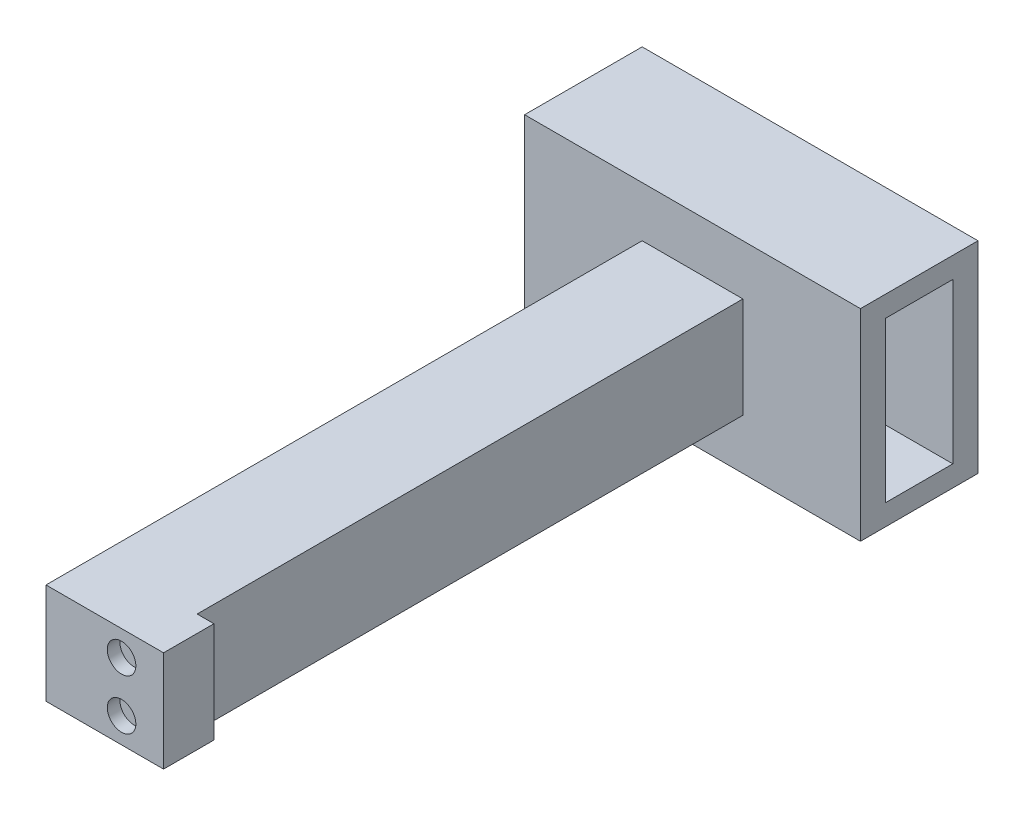
ISO-10303-21;
HEADER;
FILE_DESCRIPTION(('STEP AP214'),'2;1');
FILE_NAME('part.step','',(''),(''),'','','');
FILE_SCHEMA(('AUTOMOTIVE_DESIGN { 1 0 10303 214 1 1 1 1 }'));
ENDSEC;
DATA;
#1=APPLICATION_CONTEXT('core data for automotive mechanical design processes');
#2=APPLICATION_PROTOCOL_DEFINITION('international standard','automotive_design',2000,#1);
#3=PRODUCT_CONTEXT('',#1,'mechanical');
#4=PRODUCT('Part','Part','',(#3));
#5=PRODUCT_RELATED_PRODUCT_CATEGORY('part','',(#4));
#6=PRODUCT_DEFINITION_FORMATION('','',#4);
#7=PRODUCT_DEFINITION_CONTEXT('part definition',#1,'design');
#8=PRODUCT_DEFINITION('design','',#6,#7);
#9=PRODUCT_DEFINITION_SHAPE('','',#8);
#10=(LENGTH_UNIT() NAMED_UNIT(*) SI_UNIT(.MILLI.,.METRE.));
#11=(NAMED_UNIT(*) PLANE_ANGLE_UNIT() SI_UNIT($,.RADIAN.));
#12=(NAMED_UNIT(*) SI_UNIT($,.STERADIAN.) SOLID_ANGLE_UNIT());
#13=UNCERTAINTY_MEASURE_WITH_UNIT(LENGTH_MEASURE(1.E-05),#10,'distance_accuracy_value','');
#14=(GEOMETRIC_REPRESENTATION_CONTEXT(3) GLOBAL_UNCERTAINTY_ASSIGNED_CONTEXT((#13)) GLOBAL_UNIT_ASSIGNED_CONTEXT((#10,
#11,#12)) REPRESENTATION_CONTEXT('',''));
#15=CARTESIAN_POINT('',(0.,0.,0.));
#16=DIRECTION('',(0.,0.,1.));
#17=DIRECTION('',(1.,0.,0.));
#18=AXIS2_PLACEMENT_3D('',#15,#16,#17);
#19=CARTESIAN_POINT('',(0.,0.,-6.));
#20=DIRECTION('',(0.,0.,-1.));
#21=DIRECTION('',(-1.,0.,0.));
#22=AXIS2_PLACEMENT_3D('',#19,#20,#21);
#23=PLANE('',#22);
#24=DIRECTION('',(1.,0.,0.));
#25=VECTOR('',#24,1.);
#26=CARTESIAN_POINT('',(-44.,-26.,-6.));
#27=LINE('',#26,#25);
#28=CARTESIAN_POINT('',(-32.,-26.,-6.));
#29=VERTEX_POINT('',#28);
#30=CARTESIAN_POINT('',(-30.,-26.,-6.));
#31=VERTEX_POINT('',#30);
#32=EDGE_CURVE('E223',#29,#31,#27,.T.);
#33=ORIENTED_EDGE('',*,*,#32,.F.);
#34=DIRECTION('',(0.,1.,0.));
#35=VECTOR('',#34,1.);
#36=CARTESIAN_POINT('',(-32.,0.,-6.));
#37=LINE('',#36,#35);
#38=CARTESIAN_POINT('',(-32.,-14.,-6.));
#39=VERTEX_POINT('',#38);
#40=EDGE_CURVE('E251',#29,#39,#37,.T.);
#41=ORIENTED_EDGE('',*,*,#40,.T.);
#42=DIRECTION('',(-1.,0.,0.));
#43=VECTOR('',#42,1.);
#44=CARTESIAN_POINT('',(-44.,-14.,-6.));
#45=LINE('',#44,#43);
#46=CARTESIAN_POINT('',(-30.,-14.,-6.));
#47=VERTEX_POINT('',#46);
#48=EDGE_CURVE('E228',#47,#39,#45,.T.);
#49=ORIENTED_EDGE('',*,*,#48,.F.);
#50=DIRECTION('',(0.,1.,0.));
#51=VECTOR('',#50,1.);
#52=CARTESIAN_POINT('',(-30.,-26.,-6.));
#53=LINE('',#52,#51);
#54=EDGE_CURVE('E236',#31,#47,#53,.T.);
#55=ORIENTED_EDGE('',*,*,#54,.F.);
#56=EDGE_LOOP('',(#33,#41,#49,#55));
#57=FACE_BOUND('',#56,.T.);
#58=ADVANCED_FACE('F39',(#57),#23,.T.);
#59=CARTESIAN_POINT('',(-35.,-23.,0.));
#60=DIRECTION('',(0.,0.,-1.));
#61=DIRECTION('',(-1.,0.,0.));
#62=AXIS2_PLACEMENT_3D('',#59,#60,#61);
#63=CYLINDRICAL_SURFACE('',#62,1.7);
#64=CARTESIAN_POINT('',(-35.,-23.,0.));
#65=DIRECTION('',(0.,0.,1.));
#66=DIRECTION('',(1.,0.,0.));
#67=AXIS2_PLACEMENT_3D('',#64,#65,#66);
#68=CIRCLE('',#67,1.7);
#69=CARTESIAN_POINT('',(-33.3,-23.,0.));
#70=VERTEX_POINT('',#69);
#71=EDGE_CURVE('E225',#70,#70,#68,.T.);
#72=ORIENTED_EDGE('',*,*,#71,.T.);
#73=EDGE_LOOP('',(#72));
#74=FACE_BOUND('',#73,.T.);
#75=CARTESIAN_POINT('',(-35.,-23.,-1.49999999999999));
#76=DIRECTION('',(0.,0.,-1.));
#77=DIRECTION('',(-1.,0.,0.));
#78=AXIS2_PLACEMENT_3D('',#75,#76,#77);
#79=CIRCLE('',#78,1.7);
#80=CARTESIAN_POINT('',(-36.7,-23.,-1.49999999999999));
#81=VERTEX_POINT('',#80);
#82=EDGE_CURVE('E216',#81,#81,#79,.T.);
#83=ORIENTED_EDGE('',*,*,#82,.T.);
#84=EDGE_LOOP('',(#83));
#85=FACE_BOUND('',#84,.T.);
#86=ADVANCED_FACE('F279',(#74,#85),#63,.F.);
#87=CARTESIAN_POINT('',(-35.,-17.,0.));
#88=DIRECTION('',(0.,0.,-1.));
#89=DIRECTION('',(-1.,0.,0.));
#90=AXIS2_PLACEMENT_3D('',#87,#88,#89);
#91=CYLINDRICAL_SURFACE('',#90,1.7);
#92=CARTESIAN_POINT('',(-35.,-17.,0.));
#93=DIRECTION('',(0.,0.,1.));
#94=DIRECTION('',(1.,0.,0.));
#95=AXIS2_PLACEMENT_3D('',#92,#93,#94);
#96=CIRCLE('',#95,1.7);
#97=CARTESIAN_POINT('',(-33.3,-17.,0.));
#98=VERTEX_POINT('',#97);
#99=EDGE_CURVE('E218',#98,#98,#96,.T.);
#100=ORIENTED_EDGE('',*,*,#99,.T.);
#101=EDGE_LOOP('',(#100));
#102=FACE_BOUND('',#101,.T.);
#103=CARTESIAN_POINT('',(-35.,-17.,-1.49999999999999));
#104=DIRECTION('',(0.,0.,-1.));
#105=DIRECTION('',(-1.,0.,0.));
#106=AXIS2_PLACEMENT_3D('',#103,#104,#105);
#107=CIRCLE('',#106,1.7);
#108=CARTESIAN_POINT('',(-36.7,-17.,-1.49999999999999));
#109=VERTEX_POINT('',#108);
#110=EDGE_CURVE('E214',#109,#109,#107,.T.);
#111=ORIENTED_EDGE('',*,*,#110,.T.);
#112=EDGE_LOOP('',(#111));
#113=FACE_BOUND('',#112,.T.);
#114=ADVANCED_FACE('F283',(#102,#113),#91,.F.);
#115=CARTESIAN_POINT('',(0.,0.,0.));
#116=DIRECTION('',(0.,0.,-1.));
#117=DIRECTION('',(-1.,0.,0.));
#118=AXIS2_PLACEMENT_3D('',#115,#116,#117);
#119=PLANE('',#118);
#120=DIRECTION('',(0.,-1.,0.));
#121=VECTOR('',#120,1.);
#122=CARTESIAN_POINT('',(-44.,-26.,0.));
#123=LINE('',#122,#121);
#124=CARTESIAN_POINT('',(-44.,-14.,0.));
#125=VERTEX_POINT('',#124);
#126=CARTESIAN_POINT('',(-44.,-26.,0.));
#127=VERTEX_POINT('',#126);
#128=EDGE_CURVE('E227',#125,#127,#123,.T.);
#129=ORIENTED_EDGE('',*,*,#128,.T.);
#130=DIRECTION('',(1.,0.,0.));
#131=VECTOR('',#130,1.);
#132=CARTESIAN_POINT('',(-44.,-26.,0.));
#133=LINE('',#132,#131);
#134=CARTESIAN_POINT('',(-30.,-26.,0.));
#135=VERTEX_POINT('',#134);
#136=EDGE_CURVE('E226',#127,#135,#133,.T.);
#137=ORIENTED_EDGE('',*,*,#136,.T.);
#138=DIRECTION('',(0.,1.,0.));
#139=VECTOR('',#138,1.);
#140=CARTESIAN_POINT('',(-30.,-26.,0.));
#141=LINE('',#140,#139);
#142=CARTESIAN_POINT('',(-30.,-14.,0.));
#143=VERTEX_POINT('',#142);
#144=EDGE_CURVE('E234',#135,#143,#141,.T.);
#145=ORIENTED_EDGE('',*,*,#144,.T.);
#146=DIRECTION('',(-1.,0.,0.));
#147=VECTOR('',#146,1.);
#148=CARTESIAN_POINT('',(-44.,-14.,0.));
#149=LINE('',#148,#147);
#150=EDGE_CURVE('E235',#143,#125,#149,.T.);
#151=ORIENTED_EDGE('',*,*,#150,.T.);
#152=EDGE_LOOP('',(#129,#137,#145,#151));
#153=FACE_BOUND('',#152,.T.);
#154=ORIENTED_EDGE('',*,*,#71,.F.);
#155=EDGE_LOOP('',(#154));
#156=FACE_BOUND('',#155,.T.);
#157=ORIENTED_EDGE('',*,*,#99,.F.);
#158=EDGE_LOOP('',(#157));
#159=FACE_BOUND('',#158,.T.);
#160=ADVANCED_FACE('F292',(#153,#156,#159),#119,.F.);
#161=CARTESIAN_POINT('',(-44.,-26.,0.));
#162=DIRECTION('',(1.,0.,0.));
#163=DIRECTION('',(0.,0.,-1.));
#164=AXIS2_PLACEMENT_3D('',#161,#162,#163);
#165=PLANE('',#164);
#166=DIRECTION('',(0.,0.,-1.));
#167=VECTOR('',#166,1.);
#168=CARTESIAN_POINT('',(-44.,-14.,0.));
#169=LINE('',#168,#167);
#170=CARTESIAN_POINT('',(-44.,-14.,-71.));
#171=VERTEX_POINT('',#170);
#172=EDGE_CURVE('E237',#125,#171,#169,.T.);
#173=ORIENTED_EDGE('',*,*,#172,.T.);
#174=DIRECTION('',(0.,-1.,0.));
#175=VECTOR('',#174,1.);
#176=CARTESIAN_POINT('',(-44.,-26.,-71.));
#177=LINE('',#176,#175);
#178=CARTESIAN_POINT('',(-44.,-26.,-71.));
#179=VERTEX_POINT('',#178);
#180=EDGE_CURVE('E197',#171,#179,#177,.T.);
#181=ORIENTED_EDGE('',*,*,#180,.T.);
#182=DIRECTION('',(0.,0.,-1.));
#183=VECTOR('',#182,1.);
#184=CARTESIAN_POINT('',(-44.,-26.,0.));
#185=LINE('',#184,#183);
#186=EDGE_CURVE('E246',#127,#179,#185,.T.);
#187=ORIENTED_EDGE('',*,*,#186,.F.);
#188=ORIENTED_EDGE('',*,*,#128,.F.);
#189=EDGE_LOOP('',(#173,#181,#187,#188));
#190=FACE_BOUND('',#189,.T.);
#191=ADVANCED_FACE('F41',(#190),#165,.F.);
#192=CARTESIAN_POINT('',(-44.,-26.,0.));
#193=DIRECTION('',(0.,1.,0.));
#194=DIRECTION('',(0.,0.,1.));
#195=AXIS2_PLACEMENT_3D('',#192,#193,#194);
#196=PLANE('',#195);
#197=ORIENTED_EDGE('',*,*,#186,.T.);
#198=DIRECTION('',(1.,0.,0.));
#199=VECTOR('',#198,1.);
#200=CARTESIAN_POINT('',(-44.,-26.,-71.));
#201=LINE('',#200,#199);
#202=CARTESIAN_POINT('',(-32.,-26.,-71.));
#203=VERTEX_POINT('',#202);
#204=EDGE_CURVE('E199',#179,#203,#201,.T.);
#205=ORIENTED_EDGE('',*,*,#204,.T.);
#206=DIRECTION('',(0.,0.,-1.));
#207=VECTOR('',#206,1.);
#208=CARTESIAN_POINT('',(-32.,-26.,-1.49999999999999));
#209=LINE('',#208,#207);
#210=EDGE_CURVE('E215',#29,#203,#209,.T.);
#211=ORIENTED_EDGE('',*,*,#210,.F.);
#212=ORIENTED_EDGE('',*,*,#32,.T.);
#213=DIRECTION('',(0.,0.,-1.));
#214=VECTOR('',#213,1.);
#215=CARTESIAN_POINT('',(-30.,-26.,0.));
#216=LINE('',#215,#214);
#217=EDGE_CURVE('E249',#135,#31,#216,.T.);
#218=ORIENTED_EDGE('',*,*,#217,.F.);
#219=ORIENTED_EDGE('',*,*,#136,.F.);
#220=EDGE_LOOP('',(#197,#205,#211,#212,#218,#219));
#221=FACE_BOUND('',#220,.T.);
#222=ADVANCED_FACE('F299',(#221),#196,.F.);
#223=CARTESIAN_POINT('',(-30.,-26.,0.));
#224=DIRECTION('',(-1.,0.,0.));
#225=DIRECTION('',(0.,0.,1.));
#226=AXIS2_PLACEMENT_3D('',#223,#224,#225);
#227=PLANE('',#226);
#228=ORIENTED_EDGE('',*,*,#54,.T.);
#229=DIRECTION('',(0.,0.,-1.));
#230=VECTOR('',#229,1.);
#231=CARTESIAN_POINT('',(-30.,-14.,0.));
#232=LINE('',#231,#230);
#233=EDGE_CURVE('E241',#143,#47,#232,.T.);
#234=ORIENTED_EDGE('',*,*,#233,.F.);
#235=ORIENTED_EDGE('',*,*,#144,.F.);
#236=ORIENTED_EDGE('',*,*,#217,.T.);
#237=EDGE_LOOP('',(#228,#234,#235,#236));
#238=FACE_BOUND('',#237,.T.);
#239=ADVANCED_FACE('F297',(#238),#227,.F.);
#240=CARTESIAN_POINT('',(-44.,-14.,0.));
#241=DIRECTION('',(0.,-1.,0.));
#242=DIRECTION('',(0.,0.,-1.));
#243=AXIS2_PLACEMENT_3D('',#240,#241,#242);
#244=PLANE('',#243);
#245=DIRECTION('',(-1.,0.,0.));
#246=VECTOR('',#245,1.);
#247=CARTESIAN_POINT('',(-44.,-14.,-71.));
#248=LINE('',#247,#246);
#249=CARTESIAN_POINT('',(-32.,-14.,-71.));
#250=VERTEX_POINT('',#249);
#251=EDGE_CURVE('E206',#250,#171,#248,.T.);
#252=ORIENTED_EDGE('',*,*,#251,.T.);
#253=ORIENTED_EDGE('',*,*,#172,.F.);
#254=ORIENTED_EDGE('',*,*,#150,.F.);
#255=ORIENTED_EDGE('',*,*,#233,.T.);
#256=ORIENTED_EDGE('',*,*,#48,.T.);
#257=DIRECTION('',(0.,0.,-1.));
#258=VECTOR('',#257,1.);
#259=CARTESIAN_POINT('',(-32.,-14.,-1.49999999999999));
#260=LINE('',#259,#258);
#261=EDGE_CURVE('E207',#39,#250,#260,.T.);
#262=ORIENTED_EDGE('',*,*,#261,.T.);
#263=EDGE_LOOP('',(#252,#253,#254,#255,#256,#262));
#264=FACE_BOUND('',#263,.T.);
#265=ADVANCED_FACE('F295',(#264),#244,.F.);
#266=CARTESIAN_POINT('',(0.,0.,-1.49999999999999));
#267=DIRECTION('',(0.,0.,-1.));
#268=DIRECTION('',(-1.,0.,0.));
#269=AXIS2_PLACEMENT_3D('',#266,#267,#268);
#270=PLANE('',#269);
#271=ORIENTED_EDGE('',*,*,#110,.F.);
#272=EDGE_LOOP('',(#271));
#273=FACE_BOUND('',#272,.T.);
#274=ADVANCED_FACE('F293',(#273),#270,.F.);
#275=ORIENTED_EDGE('',*,*,#82,.F.);
#276=EDGE_LOOP('',(#275));
#277=FACE_BOUND('',#276,.T.);
#278=ADVANCED_FACE('F331',(#277),#270,.F.);
#279=CARTESIAN_POINT('',(-32.,-26.,-1.49999999999999));
#280=DIRECTION('',(-1.,0.,0.));
#281=DIRECTION('',(0.,0.,1.));
#282=AXIS2_PLACEMENT_3D('',#279,#280,#281);
#283=PLANE('',#282);
#284=ORIENTED_EDGE('',*,*,#40,.F.);
#285=ORIENTED_EDGE('',*,*,#210,.T.);
#286=DIRECTION('',(0.,1.,0.));
#287=VECTOR('',#286,1.);
#288=CARTESIAN_POINT('',(-32.,-26.,-71.));
#289=LINE('',#288,#287);
#290=EDGE_CURVE('E201',#203,#250,#289,.T.);
#291=ORIENTED_EDGE('',*,*,#290,.T.);
#292=ORIENTED_EDGE('',*,*,#261,.F.);
#293=EDGE_LOOP('',(#284,#285,#291,#292));
#294=FACE_BOUND('',#293,.T.);
#295=ADVANCED_FACE('F312',(#294),#283,.F.);
#296=CARTESIAN_POINT('',(-58.,-32.,-71.));
#297=DIRECTION('',(1.,0.,0.));
#298=DIRECTION('',(0.,0.,-1.));
#299=AXIS2_PLACEMENT_3D('',#296,#297,#298);
#300=PLANE('',#299);
#301=DIRECTION('',(0.,-1.,0.));
#302=VECTOR('',#301,1.);
#303=CARTESIAN_POINT('',(-58.,-10.49,-74.));
#304=LINE('',#303,#302);
#305=CARTESIAN_POINT('',(-58.,-10.49,-74.));
#306=VERTEX_POINT('',#305);
#307=CARTESIAN_POINT('',(-58.,-29.51,-74.));
#308=VERTEX_POINT('',#307);
#309=EDGE_CURVE('E150',#306,#308,#304,.T.);
#310=ORIENTED_EDGE('',*,*,#309,.T.);
#311=DIRECTION('',(0.,0.,-1.));
#312=VECTOR('',#311,1.);
#313=CARTESIAN_POINT('',(-58.,-29.51,-74.));
#314=LINE('',#313,#312);
#315=CARTESIAN_POINT('',(-58.,-29.51,-82.));
#316=VERTEX_POINT('',#315);
#317=EDGE_CURVE('E141',#308,#316,#314,.T.);
#318=ORIENTED_EDGE('',*,*,#317,.T.);
#319=DIRECTION('',(0.,1.,0.));
#320=VECTOR('',#319,1.);
#321=CARTESIAN_POINT('',(-58.,-29.51,-82.));
#322=LINE('',#321,#320);
#323=CARTESIAN_POINT('',(-58.,-10.49,-82.));
#324=VERTEX_POINT('',#323);
#325=EDGE_CURVE('E147',#316,#324,#322,.T.);
#326=ORIENTED_EDGE('',*,*,#325,.T.);
#327=DIRECTION('',(0.,0.,1.));
#328=VECTOR('',#327,1.);
#329=CARTESIAN_POINT('',(-58.,-10.49,-82.));
#330=LINE('',#329,#328);
#331=EDGE_CURVE('E53',#324,#306,#330,.T.);
#332=ORIENTED_EDGE('',*,*,#331,.T.);
#333=EDGE_LOOP('',(#310,#318,#326,#332));
#334=FACE_BOUND('',#333,.T.);
#335=DIRECTION('',(0.,-1.,0.));
#336=VECTOR('',#335,1.);
#337=CARTESIAN_POINT('',(-58.,-32.,-85.));
#338=LINE('',#337,#336);
#339=CARTESIAN_POINT('',(-58.,-8.,-85.));
#340=VERTEX_POINT('',#339);
#341=CARTESIAN_POINT('',(-58.,-32.,-85.));
#342=VERTEX_POINT('',#341);
#343=EDGE_CURVE('E162',#340,#342,#338,.T.);
#344=ORIENTED_EDGE('',*,*,#343,.T.);
#345=DIRECTION('',(0.,0.,-1.));
#346=VECTOR('',#345,1.);
#347=CARTESIAN_POINT('',(-58.,-32.,-71.));
#348=LINE('',#347,#346);
#349=CARTESIAN_POINT('',(-58.,-32.,-71.));
#350=VERTEX_POINT('',#349);
#351=EDGE_CURVE('E195',#350,#342,#348,.T.);
#352=ORIENTED_EDGE('',*,*,#351,.F.);
#353=DIRECTION('',(0.,-1.,0.));
#354=VECTOR('',#353,1.);
#355=CARTESIAN_POINT('',(-58.,-32.,-71.));
#356=LINE('',#355,#354);
#357=CARTESIAN_POINT('',(-58.,-8.,-71.));
#358=VERTEX_POINT('',#357);
#359=EDGE_CURVE('E169',#358,#350,#356,.T.);
#360=ORIENTED_EDGE('',*,*,#359,.F.);
#361=DIRECTION('',(0.,0.,-1.));
#362=VECTOR('',#361,1.);
#363=CARTESIAN_POINT('',(-58.,-8.,-71.));
#364=LINE('',#363,#362);
#365=EDGE_CURVE('E177',#358,#340,#364,.T.);
#366=ORIENTED_EDGE('',*,*,#365,.T.);
#367=EDGE_LOOP('',(#344,#352,#360,#366));
#368=FACE_BOUND('',#367,.T.);
#369=ADVANCED_FACE('F152',(#334,#368),#300,.F.);
#370=CARTESIAN_POINT('',(-58.,-32.,-71.));
#371=DIRECTION('',(0.,1.,0.));
#372=DIRECTION('',(0.,0.,1.));
#373=AXIS2_PLACEMENT_3D('',#370,#371,#372);
#374=PLANE('',#373);
#375=DIRECTION('',(1.,0.,0.));
#376=VECTOR('',#375,1.);
#377=CARTESIAN_POINT('',(-58.,-32.,-85.));
#378=LINE('',#377,#376);
#379=CARTESIAN_POINT('',(-18.,-32.,-85.));
#380=VERTEX_POINT('',#379);
#381=EDGE_CURVE('E182',#342,#380,#378,.T.);
#382=ORIENTED_EDGE('',*,*,#381,.T.);
#383=DIRECTION('',(0.,0.,-1.));
#384=VECTOR('',#383,1.);
#385=CARTESIAN_POINT('',(-18.,-32.,-71.));
#386=LINE('',#385,#384);
#387=CARTESIAN_POINT('',(-18.,-32.,-71.));
#388=VERTEX_POINT('',#387);
#389=EDGE_CURVE('E193',#388,#380,#386,.T.);
#390=ORIENTED_EDGE('',*,*,#389,.F.);
#391=DIRECTION('',(1.,0.,0.));
#392=VECTOR('',#391,1.);
#393=CARTESIAN_POINT('',(-58.,-32.,-71.));
#394=LINE('',#393,#392);
#395=EDGE_CURVE('E172',#350,#388,#394,.T.);
#396=ORIENTED_EDGE('',*,*,#395,.F.);
#397=ORIENTED_EDGE('',*,*,#351,.T.);
#398=EDGE_LOOP('',(#382,#390,#396,#397));
#399=FACE_BOUND('',#398,.T.);
#400=ADVANCED_FACE('F346',(#399),#374,.F.);
#401=CARTESIAN_POINT('',(-18.,-32.,-71.));
#402=DIRECTION('',(-1.,0.,0.));
#403=DIRECTION('',(0.,0.,1.));
#404=AXIS2_PLACEMENT_3D('',#401,#402,#403);
#405=PLANE('',#404);
#406=DIRECTION('',(0.,-1.,0.));
#407=VECTOR('',#406,1.);
#408=CARTESIAN_POINT('',(-18.,-32.,-82.));
#409=LINE('',#408,#407);
#410=CARTESIAN_POINT('',(-18.,-10.49,-82.));
#411=VERTEX_POINT('',#410);
#412=CARTESIAN_POINT('',(-18.,-29.51,-82.));
#413=VERTEX_POINT('',#412);
#414=EDGE_CURVE('E256',#411,#413,#409,.T.);
#415=ORIENTED_EDGE('',*,*,#414,.T.);
#416=DIRECTION('',(0.,0.,1.));
#417=VECTOR('',#416,1.);
#418=CARTESIAN_POINT('',(-18.,-29.51,-71.));
#419=LINE('',#418,#417);
#420=CARTESIAN_POINT('',(-18.,-29.51,-74.));
#421=VERTEX_POINT('',#420);
#422=EDGE_CURVE('E11',#413,#421,#419,.T.);
#423=ORIENTED_EDGE('',*,*,#422,.T.);
#424=DIRECTION('',(0.,1.,0.));
#425=VECTOR('',#424,1.);
#426=CARTESIAN_POINT('',(-18.,-32.,-74.));
#427=LINE('',#426,#425);
#428=CARTESIAN_POINT('',(-18.,-10.49,-74.));
#429=VERTEX_POINT('',#428);
#430=EDGE_CURVE('E50',#421,#429,#427,.T.);
#431=ORIENTED_EDGE('',*,*,#430,.T.);
#432=DIRECTION('',(0.,0.,-1.));
#433=VECTOR('',#432,1.);
#434=CARTESIAN_POINT('',(-18.,-10.49,-71.));
#435=LINE('',#434,#433);
#436=EDGE_CURVE('E257',#429,#411,#435,.T.);
#437=ORIENTED_EDGE('',*,*,#436,.T.);
#438=EDGE_LOOP('',(#415,#423,#431,#437));
#439=FACE_BOUND('',#438,.T.);
#440=DIRECTION('',(0.,1.,0.));
#441=VECTOR('',#440,1.);
#442=CARTESIAN_POINT('',(-18.,-32.,-85.));
#443=LINE('',#442,#441);
#444=CARTESIAN_POINT('',(-18.,-8.,-85.));
#445=VERTEX_POINT('',#444);
#446=EDGE_CURVE('E181',#380,#445,#443,.T.);
#447=ORIENTED_EDGE('',*,*,#446,.T.);
#448=DIRECTION('',(0.,0.,-1.));
#449=VECTOR('',#448,1.);
#450=CARTESIAN_POINT('',(-18.,-8.,-71.));
#451=LINE('',#450,#449);
#452=CARTESIAN_POINT('',(-18.,-8.,-71.));
#453=VERTEX_POINT('',#452);
#454=EDGE_CURVE('E189',#453,#445,#451,.T.);
#455=ORIENTED_EDGE('',*,*,#454,.F.);
#456=DIRECTION('',(0.,1.,0.));
#457=VECTOR('',#456,1.);
#458=CARTESIAN_POINT('',(-18.,-32.,-71.));
#459=LINE('',#458,#457);
#460=EDGE_CURVE('E171',#388,#453,#459,.T.);
#461=ORIENTED_EDGE('',*,*,#460,.F.);
#462=ORIENTED_EDGE('',*,*,#389,.T.);
#463=EDGE_LOOP('',(#447,#455,#461,#462));
#464=FACE_BOUND('',#463,.T.);
#465=ADVANCED_FACE('F262',(#439,#464),#405,.F.);
#466=CARTESIAN_POINT('',(-58.,-8.,-71.));
#467=DIRECTION('',(0.,-1.,0.));
#468=DIRECTION('',(0.,0.,-1.));
#469=AXIS2_PLACEMENT_3D('',#466,#467,#468);
#470=PLANE('',#469);
#471=DIRECTION('',(-1.,0.,0.));
#472=VECTOR('',#471,1.);
#473=CARTESIAN_POINT('',(-58.,-8.,-85.));
#474=LINE('',#473,#472);
#475=EDGE_CURVE('E175',#445,#340,#474,.T.);
#476=ORIENTED_EDGE('',*,*,#475,.T.);
#477=ORIENTED_EDGE('',*,*,#365,.F.);
#478=DIRECTION('',(-1.,0.,0.));
#479=VECTOR('',#478,1.);
#480=CARTESIAN_POINT('',(-58.,-8.,-71.));
#481=LINE('',#480,#479);
#482=EDGE_CURVE('E178',#453,#358,#481,.T.);
#483=ORIENTED_EDGE('',*,*,#482,.F.);
#484=ORIENTED_EDGE('',*,*,#454,.T.);
#485=EDGE_LOOP('',(#476,#477,#483,#484));
#486=FACE_BOUND('',#485,.T.);
#487=ADVANCED_FACE('F359',(#486),#470,.F.);
#488=CARTESIAN_POINT('',(0.,0.,-71.));
#489=DIRECTION('',(0.,0.,-1.));
#490=DIRECTION('',(-1.,0.,0.));
#491=AXIS2_PLACEMENT_3D('',#488,#489,#490);
#492=PLANE('',#491);
#493=ORIENTED_EDGE('',*,*,#180,.F.);
#494=ORIENTED_EDGE('',*,*,#251,.F.);
#495=ORIENTED_EDGE('',*,*,#290,.F.);
#496=ORIENTED_EDGE('',*,*,#204,.F.);
#497=EDGE_LOOP('',(#493,#494,#495,#496));
#498=FACE_BOUND('',#497,.T.);
#499=ORIENTED_EDGE('',*,*,#359,.T.);
#500=ORIENTED_EDGE('',*,*,#395,.T.);
#501=ORIENTED_EDGE('',*,*,#460,.T.);
#502=ORIENTED_EDGE('',*,*,#482,.T.);
#503=EDGE_LOOP('',(#499,#500,#501,#502));
#504=FACE_BOUND('',#503,.T.);
#505=ADVANCED_FACE('F315',(#498,#504),#492,.F.);
#506=CARTESIAN_POINT('',(0.,0.,-85.));
#507=DIRECTION('',(0.,0.,-1.));
#508=DIRECTION('',(-1.,0.,0.));
#509=AXIS2_PLACEMENT_3D('',#506,#507,#508);
#510=PLANE('',#509);
#511=ORIENTED_EDGE('',*,*,#343,.F.);
#512=ORIENTED_EDGE('',*,*,#475,.F.);
#513=ORIENTED_EDGE('',*,*,#446,.F.);
#514=ORIENTED_EDGE('',*,*,#381,.F.);
#515=EDGE_LOOP('',(#511,#512,#513,#514));
#516=FACE_BOUND('',#515,.T.);
#517=ADVANCED_FACE('F362',(#516),#510,.T.);
#518=CARTESIAN_POINT('',(-58.,-29.51,-74.));
#519=DIRECTION('',(0.,-1.,0.));
#520=DIRECTION('',(0.,0.,-1.));
#521=AXIS2_PLACEMENT_3D('',#518,#519,#520);
#522=PLANE('',#521);
#523=DIRECTION('',(1.,0.,0.));
#524=VECTOR('',#523,1.);
#525=CARTESIAN_POINT('',(-58.,-29.51,-82.));
#526=LINE('',#525,#524);
#527=EDGE_CURVE('E65',#316,#413,#526,.T.);
#528=ORIENTED_EDGE('',*,*,#527,.F.);
#529=ORIENTED_EDGE('',*,*,#317,.F.);
#530=DIRECTION('',(1.,0.,0.));
#531=VECTOR('',#530,1.);
#532=CARTESIAN_POINT('',(-58.,-29.51,-74.));
#533=LINE('',#532,#531);
#534=EDGE_CURVE('E161',#308,#421,#533,.T.);
#535=ORIENTED_EDGE('',*,*,#534,.T.);
#536=ORIENTED_EDGE('',*,*,#422,.F.);
#537=EDGE_LOOP('',(#528,#529,#535,#536));
#538=FACE_BOUND('',#537,.T.);
#539=ADVANCED_FACE('F136',(#538),#522,.F.);
#540=CARTESIAN_POINT('',(-58.,-10.49,-74.));
#541=DIRECTION('',(0.,0.,1.));
#542=DIRECTION('',(1.,0.,0.));
#543=AXIS2_PLACEMENT_3D('',#540,#541,#542);
#544=PLANE('',#543);
#545=ORIENTED_EDGE('',*,*,#534,.F.);
#546=ORIENTED_EDGE('',*,*,#309,.F.);
#547=DIRECTION('',(1.,0.,0.));
#548=VECTOR('',#547,1.);
#549=CARTESIAN_POINT('',(-58.,-10.49,-74.));
#550=LINE('',#549,#548);
#551=EDGE_CURVE('E163',#306,#429,#550,.T.);
#552=ORIENTED_EDGE('',*,*,#551,.T.);
#553=ORIENTED_EDGE('',*,*,#430,.F.);
#554=EDGE_LOOP('',(#545,#546,#552,#553));
#555=FACE_BOUND('',#554,.T.);
#556=ADVANCED_FACE('F270',(#555),#544,.F.);
#557=CARTESIAN_POINT('',(-58.,-10.49,-82.));
#558=DIRECTION('',(0.,1.,0.));
#559=DIRECTION('',(0.,0.,1.));
#560=AXIS2_PLACEMENT_3D('',#557,#558,#559);
#561=PLANE('',#560);
#562=ORIENTED_EDGE('',*,*,#551,.F.);
#563=ORIENTED_EDGE('',*,*,#331,.F.);
#564=DIRECTION('',(1.,0.,0.));
#565=VECTOR('',#564,1.);
#566=CARTESIAN_POINT('',(-58.,-10.49,-82.));
#567=LINE('',#566,#565);
#568=EDGE_CURVE('E148',#324,#411,#567,.T.);
#569=ORIENTED_EDGE('',*,*,#568,.T.);
#570=ORIENTED_EDGE('',*,*,#436,.F.);
#571=EDGE_LOOP('',(#562,#563,#569,#570));
#572=FACE_BOUND('',#571,.T.);
#573=ADVANCED_FACE('F268',(#572),#561,.F.);
#574=CARTESIAN_POINT('',(-58.,-29.51,-82.));
#575=DIRECTION('',(0.,0.,-1.));
#576=DIRECTION('',(-1.,0.,0.));
#577=AXIS2_PLACEMENT_3D('',#574,#575,#576);
#578=PLANE('',#577);
#579=ORIENTED_EDGE('',*,*,#568,.F.);
#580=ORIENTED_EDGE('',*,*,#325,.F.);
#581=ORIENTED_EDGE('',*,*,#527,.T.);
#582=ORIENTED_EDGE('',*,*,#414,.F.);
#583=EDGE_LOOP('',(#579,#580,#581,#582));
#584=FACE_BOUND('',#583,.T.);
#585=ADVANCED_FACE('F151',(#584),#578,.F.);
#586=CLOSED_SHELL('',(#58,#86,#114,#160,#191,#222,#239,#265,#274,#278,#295,#369,#400,#465,#487,
#505,#517,#539,#556,#573,#585));
#587=MANIFOLD_SOLID_BREP('B2',#586);
#588=ADVANCED_BREP_SHAPE_REPRESENTATION('',(#18,#587),#14);
#589=SHAPE_DEFINITION_REPRESENTATION(#9,#588);
ENDSEC;
END-ISO-10303-21;
